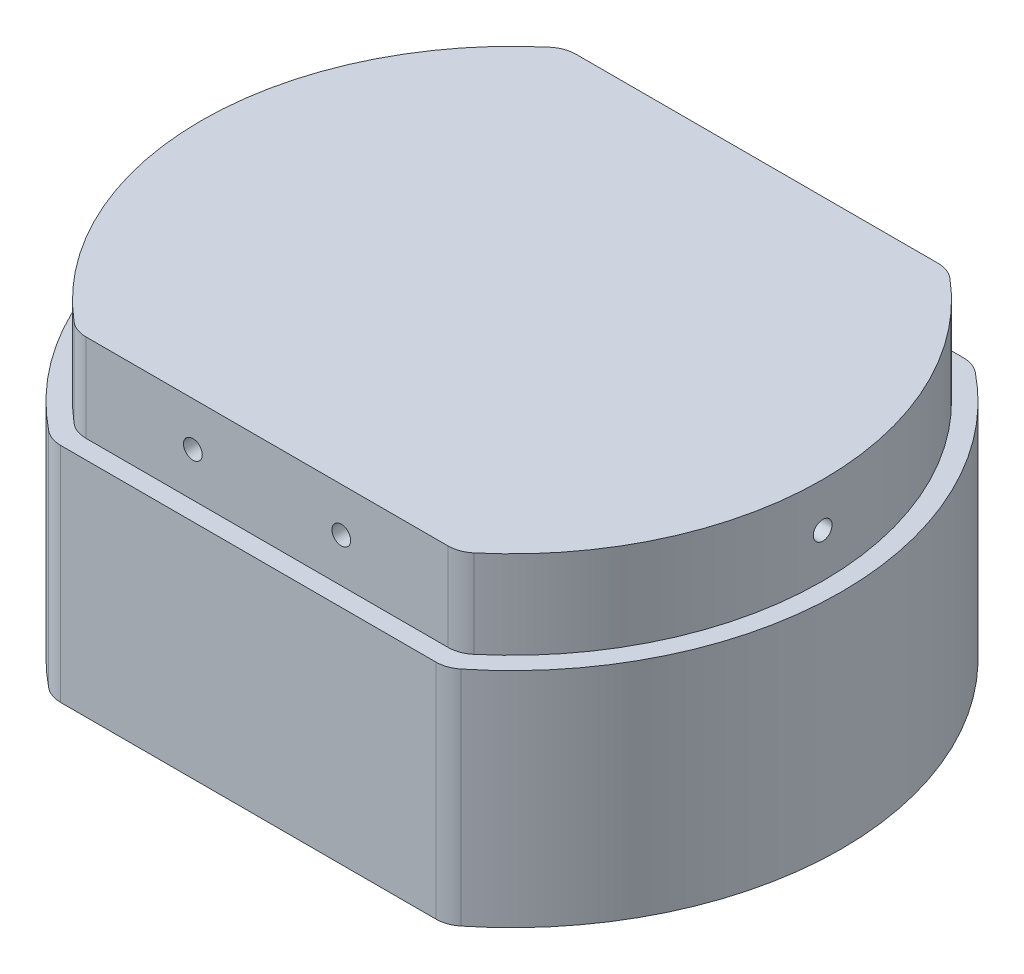
ISO-10303-21;
HEADER;
FILE_DESCRIPTION(('STEP AP214'),'2;1');
FILE_NAME('part.step','',(''),(''),'','','');
FILE_SCHEMA(('AUTOMOTIVE_DESIGN { 1 0 10303 214 1 1 1 1 }'));
ENDSEC;
DATA;
#1=APPLICATION_CONTEXT('core data for automotive mechanical design processes');
#2=APPLICATION_PROTOCOL_DEFINITION('international standard','automotive_design',2000,#1);
#3=PRODUCT_CONTEXT('',#1,'mechanical');
#4=PRODUCT('Part','Part','',(#3));
#5=PRODUCT_RELATED_PRODUCT_CATEGORY('part','',(#4));
#6=PRODUCT_DEFINITION_FORMATION('','',#4);
#7=PRODUCT_DEFINITION_CONTEXT('part definition',#1,'design');
#8=PRODUCT_DEFINITION('design','',#6,#7);
#9=PRODUCT_DEFINITION_SHAPE('','',#8);
#10=(LENGTH_UNIT() NAMED_UNIT(*) SI_UNIT(.MILLI.,.METRE.));
#11=(NAMED_UNIT(*) PLANE_ANGLE_UNIT() SI_UNIT($,.RADIAN.));
#12=(NAMED_UNIT(*) SI_UNIT($,.STERADIAN.) SOLID_ANGLE_UNIT());
#13=UNCERTAINTY_MEASURE_WITH_UNIT(LENGTH_MEASURE(1.E-05),#10,'distance_accuracy_value','');
#14=(GEOMETRIC_REPRESENTATION_CONTEXT(3) GLOBAL_UNCERTAINTY_ASSIGNED_CONTEXT((#13)) GLOBAL_UNIT_ASSIGNED_CONTEXT((#10,
#11,#12)) REPRESENTATION_CONTEXT('',''));
#15=CARTESIAN_POINT('',(0.,0.,0.));
#16=DIRECTION('',(0.,0.,1.));
#17=DIRECTION('',(1.,0.,0.));
#18=AXIS2_PLACEMENT_3D('',#15,#16,#17);
#19=CARTESIAN_POINT('',(32.0400140449408,53.,-40.));
#20=DIRECTION('',(0.,-1.,0.));
#21=DIRECTION('',(0.,0.,-1.));
#22=AXIS2_PLACEMENT_3D('',#19,#20,#21);
#23=CYLINDRICAL_SURFACE('',#22,5.00000000000001);
#24=CARTESIAN_POINT('',(32.0400140449408,38.,-40.));
#25=DIRECTION('',(0.,1.,0.));
#26=DIRECTION('',(0.,0.,1.));
#27=AXIS2_PLACEMENT_3D('',#24,#25,#26);
#28=CIRCLE('',#27,5.00000000000001);
#29=CARTESIAN_POINT('',(35.1658690737155,38.,-43.9024390243902));
#30=VERTEX_POINT('',#29);
#31=CARTESIAN_POINT('',(32.0400140449408,38.,-45.));
#32=VERTEX_POINT('',#31);
#33=EDGE_CURVE('E251',#30,#32,#28,.T.);
#34=ORIENTED_EDGE('',*,*,#33,.F.);
#35=DIRECTION('',(0.,-1.,0.));
#36=VECTOR('',#35,1.);
#37=CARTESIAN_POINT('',(35.1658690737155,53.,-43.9024390243902));
#38=LINE('',#37,#36);
#39=CARTESIAN_POINT('',(35.1658690737155,0.,-43.9024390243902));
#40=VERTEX_POINT('',#39);
#41=EDGE_CURVE('E277',#30,#40,#38,.T.);
#42=ORIENTED_EDGE('',*,*,#41,.T.);
#43=CARTESIAN_POINT('',(32.0400140449408,0.,-40.));
#44=DIRECTION('',(0.,1.,0.));
#45=DIRECTION('',(0.,0.,-1.));
#46=AXIS2_PLACEMENT_3D('',#43,#44,#45);
#47=CIRCLE('',#46,5.00000000000001);
#48=CARTESIAN_POINT('',(32.0400140449408,0.,-45.));
#49=VERTEX_POINT('',#48);
#50=EDGE_CURVE('E253',#40,#49,#47,.T.);
#51=ORIENTED_EDGE('',*,*,#50,.T.);
#52=DIRECTION('',(0.,-1.,0.));
#53=VECTOR('',#52,1.);
#54=CARTESIAN_POINT('',(32.0400140449408,53.,-45.));
#55=LINE('',#54,#53);
#56=EDGE_CURVE('E291',#32,#49,#55,.T.);
#57=ORIENTED_EDGE('',*,*,#56,.F.);
#58=EDGE_LOOP('',(#34,#42,#51,#57));
#59=FACE_BOUND('',#58,.T.);
#60=ADVANCED_FACE('F39',(#59),#23,.T.);
#61=CARTESIAN_POINT('',(-32.0400140449408,53.,-45.));
#62=DIRECTION('',(0.,0.,1.));
#63=DIRECTION('',(1.,0.,0.));
#64=AXIS2_PLACEMENT_3D('',#61,#62,#63);
#65=PLANE('',#64);
#66=DIRECTION('',(-1.,0.,0.));
#67=VECTOR('',#66,1.);
#68=CARTESIAN_POINT('',(33.75,38.,-45.));
#69=LINE('',#68,#67);
#70=CARTESIAN_POINT('',(-32.0400140449408,38.,-45.));
#71=VERTEX_POINT('',#70);
#72=EDGE_CURVE('E239',#32,#71,#69,.T.);
#73=ORIENTED_EDGE('',*,*,#72,.F.);
#74=ORIENTED_EDGE('',*,*,#56,.T.);
#75=DIRECTION('',(-1.,0.,0.));
#76=VECTOR('',#75,1.);
#77=CARTESIAN_POINT('',(-32.0400140449408,0.,-45.));
#78=LINE('',#77,#76);
#79=CARTESIAN_POINT('',(-32.0400140449408,0.,-45.));
#80=VERTEX_POINT('',#79);
#81=EDGE_CURVE('E256',#49,#80,#78,.T.);
#82=ORIENTED_EDGE('',*,*,#81,.T.);
#83=DIRECTION('',(0.,-1.,0.));
#84=VECTOR('',#83,1.);
#85=CARTESIAN_POINT('',(-32.0400140449408,53.,-45.));
#86=LINE('',#85,#84);
#87=EDGE_CURVE('E289',#71,#80,#86,.T.);
#88=ORIENTED_EDGE('',*,*,#87,.F.);
#89=EDGE_LOOP('',(#73,#74,#82,#88));
#90=FACE_BOUND('',#89,.T.);
#91=ADVANCED_FACE('F394',(#90),#65,.F.);
#92=CARTESIAN_POINT('',(-32.0400140449408,53.,-40.));
#93=DIRECTION('',(0.,-1.,0.));
#94=DIRECTION('',(0.,0.,-1.));
#95=AXIS2_PLACEMENT_3D('',#92,#93,#94);
#96=CYLINDRICAL_SURFACE('',#95,5.00000000000001);
#97=CARTESIAN_POINT('',(-32.0400140449408,38.,-40.));
#98=DIRECTION('',(0.,1.,0.));
#99=DIRECTION('',(0.,0.,1.));
#100=AXIS2_PLACEMENT_3D('',#97,#98,#99);
#101=CIRCLE('',#100,5.00000000000001);
#102=CARTESIAN_POINT('',(-35.1658690737155,38.,-43.9024390243902));
#103=VERTEX_POINT('',#102);
#104=EDGE_CURVE('E249',#71,#103,#101,.T.);
#105=ORIENTED_EDGE('',*,*,#104,.F.);
#106=ORIENTED_EDGE('',*,*,#87,.T.);
#107=CARTESIAN_POINT('',(-32.0400140449408,0.,-40.));
#108=DIRECTION('',(0.,1.,0.));
#109=DIRECTION('',(0.,0.,1.));
#110=AXIS2_PLACEMENT_3D('',#107,#108,#109);
#111=CIRCLE('',#110,5.00000000000001);
#112=CARTESIAN_POINT('',(-35.1658690737155,0.,-43.9024390243902));
#113=VERTEX_POINT('',#112);
#114=EDGE_CURVE('E259',#80,#113,#111,.T.);
#115=ORIENTED_EDGE('',*,*,#114,.T.);
#116=DIRECTION('',(0.,-1.,0.));
#117=VECTOR('',#116,1.);
#118=CARTESIAN_POINT('',(-35.1658690737155,53.,-43.9024390243902));
#119=LINE('',#118,#117);
#120=EDGE_CURVE('E287',#103,#113,#119,.T.);
#121=ORIENTED_EDGE('',*,*,#120,.F.);
#122=EDGE_LOOP('',(#105,#106,#115,#121));
#123=FACE_BOUND('',#122,.T.);
#124=ADVANCED_FACE('F401',(#123),#96,.T.);
#125=CARTESIAN_POINT('',(0.,53.,0.));
#126=DIRECTION('',(0.,-1.,0.));
#127=DIRECTION('',(0.,0.,-1.));
#128=AXIS2_PLACEMENT_3D('',#125,#126,#127);
#129=CYLINDRICAL_SURFACE('',#128,56.25);
#130=CARTESIAN_POINT('',(0.,38.,0.));
#131=DIRECTION('',(0.,1.,0.));
#132=DIRECTION('',(0.,0.,1.));
#133=AXIS2_PLACEMENT_3D('',#130,#131,#132);
#134=CIRCLE('',#133,56.25);
#135=CARTESIAN_POINT('',(-35.1658690737155,38.,43.9024390243902));
#136=VERTEX_POINT('',#135);
#137=EDGE_CURVE('E241',#103,#136,#134,.T.);
#138=ORIENTED_EDGE('',*,*,#137,.F.);
#139=ORIENTED_EDGE('',*,*,#120,.T.);
#140=CARTESIAN_POINT('',(0.,0.,0.));
#141=DIRECTION('',(0.,1.,0.));
#142=DIRECTION('',(0.,0.,1.));
#143=AXIS2_PLACEMENT_3D('',#140,#141,#142);
#144=CIRCLE('',#143,56.25);
#145=CARTESIAN_POINT('',(-35.1658690737155,0.,43.9024390243902));
#146=VERTEX_POINT('',#145);
#147=EDGE_CURVE('E262',#113,#146,#144,.T.);
#148=ORIENTED_EDGE('',*,*,#147,.T.);
#149=DIRECTION('',(0.,-1.,0.));
#150=VECTOR('',#149,1.);
#151=CARTESIAN_POINT('',(-35.1658690737155,53.,43.9024390243902));
#152=LINE('',#151,#150);
#153=EDGE_CURVE('E285',#136,#146,#152,.T.);
#154=ORIENTED_EDGE('',*,*,#153,.F.);
#155=EDGE_LOOP('',(#138,#139,#148,#154));
#156=FACE_BOUND('',#155,.T.);
#157=ADVANCED_FACE('F462',(#156),#129,.T.);
#158=CARTESIAN_POINT('',(-32.0400140449408,53.,40.));
#159=DIRECTION('',(0.,-1.,0.));
#160=DIRECTION('',(0.,0.,-1.));
#161=AXIS2_PLACEMENT_3D('',#158,#159,#160);
#162=CYLINDRICAL_SURFACE('',#161,4.99999999999999);
#163=CARTESIAN_POINT('',(-32.0400140449408,38.,40.));
#164=DIRECTION('',(0.,1.,0.));
#165=DIRECTION('',(0.,0.,1.));
#166=AXIS2_PLACEMENT_3D('',#163,#164,#165);
#167=CIRCLE('',#166,4.99999999999999);
#168=CARTESIAN_POINT('',(-32.0400140449408,38.,45.));
#169=VERTEX_POINT('',#168);
#170=EDGE_CURVE('E247',#136,#169,#167,.T.);
#171=ORIENTED_EDGE('',*,*,#170,.F.);
#172=ORIENTED_EDGE('',*,*,#153,.T.);
#173=CARTESIAN_POINT('',(-32.0400140449408,0.,40.));
#174=DIRECTION('',(0.,1.,0.));
#175=DIRECTION('',(0.,0.,-1.));
#176=AXIS2_PLACEMENT_3D('',#173,#174,#175);
#177=CIRCLE('',#176,4.99999999999999);
#178=CARTESIAN_POINT('',(-32.0400140449408,0.,45.));
#179=VERTEX_POINT('',#178);
#180=EDGE_CURVE('E265',#146,#179,#177,.T.);
#181=ORIENTED_EDGE('',*,*,#180,.T.);
#182=DIRECTION('',(0.,-1.,0.));
#183=VECTOR('',#182,1.);
#184=CARTESIAN_POINT('',(-32.0400140449408,53.,45.));
#185=LINE('',#184,#183);
#186=EDGE_CURVE('E283',#169,#179,#185,.T.);
#187=ORIENTED_EDGE('',*,*,#186,.F.);
#188=EDGE_LOOP('',(#171,#172,#181,#187));
#189=FACE_BOUND('',#188,.T.);
#190=ADVANCED_FACE('F464',(#189),#162,.T.);
#191=CARTESIAN_POINT('',(-32.0400140449408,53.,45.));
#192=DIRECTION('',(0.,0.,-1.));
#193=DIRECTION('',(-1.,0.,0.));
#194=AXIS2_PLACEMENT_3D('',#191,#192,#193);
#195=PLANE('',#194);
#196=DIRECTION('',(1.,0.,0.));
#197=VECTOR('',#196,1.);
#198=CARTESIAN_POINT('',(33.75,38.,45.));
#199=LINE('',#198,#197);
#200=CARTESIAN_POINT('',(32.0400140449408,38.,45.));
#201=VERTEX_POINT('',#200);
#202=EDGE_CURVE('E243',#169,#201,#199,.T.);
#203=ORIENTED_EDGE('',*,*,#202,.F.);
#204=ORIENTED_EDGE('',*,*,#186,.T.);
#205=DIRECTION('',(1.,0.,0.));
#206=VECTOR('',#205,1.);
#207=CARTESIAN_POINT('',(-32.0400140449408,0.,45.));
#208=LINE('',#207,#206);
#209=CARTESIAN_POINT('',(32.0400140449408,0.,45.));
#210=VERTEX_POINT('',#209);
#211=EDGE_CURVE('E268',#179,#210,#208,.T.);
#212=ORIENTED_EDGE('',*,*,#211,.T.);
#213=DIRECTION('',(0.,-1.,0.));
#214=VECTOR('',#213,1.);
#215=CARTESIAN_POINT('',(32.0400140449408,53.,45.));
#216=LINE('',#215,#214);
#217=EDGE_CURVE('E281',#201,#210,#216,.T.);
#218=ORIENTED_EDGE('',*,*,#217,.F.);
#219=EDGE_LOOP('',(#203,#204,#212,#218));
#220=FACE_BOUND('',#219,.T.);
#221=ADVANCED_FACE('F471',(#220),#195,.F.);
#222=CARTESIAN_POINT('',(32.0400140449408,53.,40.));
#223=DIRECTION('',(0.,-1.,0.));
#224=DIRECTION('',(0.,0.,-1.));
#225=AXIS2_PLACEMENT_3D('',#222,#223,#224);
#226=CYLINDRICAL_SURFACE('',#225,4.99999999999999);
#227=CARTESIAN_POINT('',(32.0400140449408,38.,40.));
#228=DIRECTION('',(0.,1.,0.));
#229=DIRECTION('',(0.,0.,1.));
#230=AXIS2_PLACEMENT_3D('',#227,#228,#229);
#231=CIRCLE('',#230,4.99999999999999);
#232=CARTESIAN_POINT('',(35.1658690737155,38.,43.9024390243902));
#233=VERTEX_POINT('',#232);
#234=EDGE_CURVE('E245',#201,#233,#231,.T.);
#235=ORIENTED_EDGE('',*,*,#234,.F.);
#236=ORIENTED_EDGE('',*,*,#217,.T.);
#237=CARTESIAN_POINT('',(32.0400140449408,0.,40.));
#238=DIRECTION('',(0.,1.,0.));
#239=DIRECTION('',(0.,0.,1.));
#240=AXIS2_PLACEMENT_3D('',#237,#238,#239);
#241=CIRCLE('',#240,4.99999999999999);
#242=CARTESIAN_POINT('',(35.1658690737155,0.,43.9024390243902));
#243=VERTEX_POINT('',#242);
#244=EDGE_CURVE('E271',#210,#243,#241,.T.);
#245=ORIENTED_EDGE('',*,*,#244,.T.);
#246=DIRECTION('',(0.,-1.,0.));
#247=VECTOR('',#246,1.);
#248=CARTESIAN_POINT('',(35.1658690737155,53.,43.9024390243902));
#249=LINE('',#248,#247);
#250=EDGE_CURVE('E279',#233,#243,#249,.T.);
#251=ORIENTED_EDGE('',*,*,#250,.F.);
#252=EDGE_LOOP('',(#235,#236,#245,#251));
#253=FACE_BOUND('',#252,.T.);
#254=ADVANCED_FACE('F473',(#253),#226,.T.);
#255=CARTESIAN_POINT('',(0.,53.,0.));
#256=DIRECTION('',(0.,-1.,0.));
#257=DIRECTION('',(0.,0.,-1.));
#258=AXIS2_PLACEMENT_3D('',#255,#256,#257);
#259=CYLINDRICAL_SURFACE('',#258,56.25);
#260=CARTESIAN_POINT('',(0.,38.,0.));
#261=DIRECTION('',(0.,1.,0.));
#262=DIRECTION('',(0.,0.,1.));
#263=AXIS2_PLACEMENT_3D('',#260,#261,#262);
#264=CIRCLE('',#263,56.25);
#265=EDGE_CURVE('E227',#233,#30,#264,.T.);
#266=ORIENTED_EDGE('',*,*,#265,.F.);
#267=ORIENTED_EDGE('',*,*,#250,.T.);
#268=CARTESIAN_POINT('',(0.,0.,0.));
#269=DIRECTION('',(0.,1.,0.));
#270=DIRECTION('',(0.,0.,1.));
#271=AXIS2_PLACEMENT_3D('',#268,#269,#270);
#272=CIRCLE('',#271,56.25);
#273=EDGE_CURVE('E274',#243,#40,#272,.T.);
#274=ORIENTED_EDGE('',*,*,#273,.T.);
#275=ORIENTED_EDGE('',*,*,#41,.F.);
#276=EDGE_LOOP('',(#266,#267,#274,#275));
#277=FACE_BOUND('',#276,.T.);
#278=ADVANCED_FACE('F476',(#277),#259,.T.);
#279=CARTESIAN_POINT('',(32.0400140449408,0.,-40.));
#280=DIRECTION('',(0.,-1.,0.));
#281=DIRECTION('',(0.,0.,-1.));
#282=AXIS2_PLACEMENT_3D('',#279,#280,#281);
#283=PLANE('',#282);
#284=ORIENTED_EDGE('',*,*,#50,.F.);
#285=ORIENTED_EDGE('',*,*,#273,.F.);
#286=ORIENTED_EDGE('',*,*,#244,.F.);
#287=ORIENTED_EDGE('',*,*,#211,.F.);
#288=ORIENTED_EDGE('',*,*,#180,.F.);
#289=ORIENTED_EDGE('',*,*,#147,.F.);
#290=ORIENTED_EDGE('',*,*,#114,.F.);
#291=ORIENTED_EDGE('',*,*,#81,.F.);
#292=EDGE_LOOP('',(#284,#285,#286,#287,#288,#289,#290,#291));
#293=FACE_BOUND('',#292,.T.);
#294=ADVANCED_FACE('F440',(#293),#283,.T.);
#295=CARTESIAN_POINT('',(0.,38.,0.));
#296=DIRECTION('',(0.,1.,0.));
#297=DIRECTION('',(0.,0.,1.));
#298=AXIS2_PLACEMENT_3D('',#295,#296,#297);
#299=PLANE('',#298);
#300=DIRECTION('',(-1.,0.,0.));
#301=VECTOR('',#300,1.);
#302=CARTESIAN_POINT('',(32.6659226105739,38.,-41.8));
#303=LINE('',#302,#301);
#304=CARTESIAN_POINT('',(30.895994886069,38.,-41.8));
#305=VERTEX_POINT('',#304);
#306=CARTESIAN_POINT('',(-30.895994886069,38.,-41.8));
#307=VERTEX_POINT('',#306);
#308=EDGE_CURVE('E224',#305,#307,#303,.T.);
#309=ORIENTED_EDGE('',*,*,#308,.F.);
#310=CARTESIAN_POINT('',(30.895994886069,38.,-36.8));
#311=DIRECTION('',(0.,1.,0.));
#312=DIRECTION('',(0.,0.,1.));
#313=AXIS2_PLACEMENT_3D('',#310,#311,#312);
#314=CIRCLE('',#313,5.);
#315=CARTESIAN_POINT('',(34.1109787451813,38.,-40.6293444328824));
#316=VERTEX_POINT('',#315);
#317=EDGE_CURVE('E322',#305,#316,#314,.F.);
#318=ORIENTED_EDGE('',*,*,#317,.T.);
#319=CARTESIAN_POINT('',(0.,38.,0.));
#320=DIRECTION('',(0.,1.,0.));
#321=DIRECTION('',(0.,0.,1.));
#322=AXIS2_PLACEMENT_3D('',#319,#320,#321);
#323=CIRCLE('',#322,53.05);
#324=CARTESIAN_POINT('',(34.1109787451813,38.,40.6293444328824));
#325=VERTEX_POINT('',#324);
#326=EDGE_CURVE('E221',#325,#316,#323,.T.);
#327=ORIENTED_EDGE('',*,*,#326,.F.);
#328=CARTESIAN_POINT('',(30.895994886069,38.,36.8));
#329=DIRECTION('',(0.,1.,0.));
#330=DIRECTION('',(0.,0.,1.));
#331=AXIS2_PLACEMENT_3D('',#328,#329,#330);
#332=CIRCLE('',#331,5.);
#333=CARTESIAN_POINT('',(30.895994886069,38.,41.8));
#334=VERTEX_POINT('',#333);
#335=EDGE_CURVE('E59',#325,#334,#332,.F.);
#336=ORIENTED_EDGE('',*,*,#335,.T.);
#337=DIRECTION('',(1.,0.,0.));
#338=VECTOR('',#337,1.);
#339=CARTESIAN_POINT('',(32.6659226105739,38.,41.8));
#340=LINE('',#339,#338);
#341=CARTESIAN_POINT('',(-30.895994886069,38.,41.8));
#342=VERTEX_POINT('',#341);
#343=EDGE_CURVE('E218',#342,#334,#340,.T.);
#344=ORIENTED_EDGE('',*,*,#343,.F.);
#345=CARTESIAN_POINT('',(-30.895994886069,38.,36.8));
#346=DIRECTION('',(0.,1.,0.));
#347=DIRECTION('',(0.,0.,1.));
#348=AXIS2_PLACEMENT_3D('',#345,#346,#347);
#349=CIRCLE('',#348,5.);
#350=CARTESIAN_POINT('',(-34.1109787451813,38.,40.6293444328824));
#351=VERTEX_POINT('',#350);
#352=EDGE_CURVE('E325',#342,#351,#349,.F.);
#353=ORIENTED_EDGE('',*,*,#352,.T.);
#354=CARTESIAN_POINT('',(0.,38.,0.));
#355=DIRECTION('',(0.,1.,0.));
#356=DIRECTION('',(0.,0.,1.));
#357=AXIS2_PLACEMENT_3D('',#354,#355,#356);
#358=CIRCLE('',#357,53.05);
#359=CARTESIAN_POINT('',(-34.1109787451813,38.,-40.6293444328824));
#360=VERTEX_POINT('',#359);
#361=EDGE_CURVE('E215',#360,#351,#358,.T.);
#362=ORIENTED_EDGE('',*,*,#361,.F.);
#363=CARTESIAN_POINT('',(-30.895994886069,38.,-36.8));
#364=DIRECTION('',(0.,1.,0.));
#365=DIRECTION('',(0.,0.,1.));
#366=AXIS2_PLACEMENT_3D('',#363,#364,#365);
#367=CIRCLE('',#366,5.);
#368=EDGE_CURVE('E320',#360,#307,#367,.F.);
#369=ORIENTED_EDGE('',*,*,#368,.T.);
#370=EDGE_LOOP('',(#309,#318,#327,#336,#344,#353,#362,#369));
#371=FACE_BOUND('',#370,.T.);
#372=ORIENTED_EDGE('',*,*,#33,.T.);
#373=ORIENTED_EDGE('',*,*,#72,.T.);
#374=ORIENTED_EDGE('',*,*,#104,.T.);
#375=ORIENTED_EDGE('',*,*,#137,.T.);
#376=ORIENTED_EDGE('',*,*,#170,.T.);
#377=ORIENTED_EDGE('',*,*,#202,.T.);
#378=ORIENTED_EDGE('',*,*,#234,.T.);
#379=ORIENTED_EDGE('',*,*,#265,.T.);
#380=EDGE_LOOP('',(#372,#373,#374,#375,#376,#377,#378,#379));
#381=FACE_BOUND('',#380,.T.);
#382=ADVANCED_FACE('F389',(#371,#381),#299,.T.);
#383=CARTESIAN_POINT('',(0.,38.,0.));
#384=DIRECTION('',(0.,1.,0.));
#385=DIRECTION('',(0.,0.,1.));
#386=AXIS2_PLACEMENT_3D('',#383,#384,#385);
#387=CYLINDRICAL_SURFACE('',#386,53.05);
#388=CARTESIAN_POINT('',(-53.0258663295566,45.5,1.6));
#389=CARTESIAN_POINT('',(-53.0258666551798,45.5898507709966,1.59999602219364));
#390=CARTESIAN_POINT('',(-53.0260971569791,45.6797661720912,1.59240600658441));
#391=CARTESIAN_POINT('',(-53.0269944805379,45.8571191528165,1.56223409653119));
#392=CARTESIAN_POINT('',(-53.027661823429,45.9445536426876,1.53963429562111));
#393=CARTESIAN_POINT('',(-53.029357164328,46.1143498326904,1.48008811468606));
#394=CARTESIAN_POINT('',(-53.0303849858318,46.1967139922894,1.44314875490988));
#395=CARTESIAN_POINT('',(-53.0326852434386,46.3540491918854,1.35598210062878));
#396=CARTESIAN_POINT('',(-53.0339576198195,46.4290220301454,1.30575804921354));
#397=CARTESIAN_POINT('',(-53.0366042995548,46.5695039015245,1.19342063613849));
#398=CARTESIAN_POINT('',(-53.0379786423478,46.6350092436112,1.13130265929336));
#399=CARTESIAN_POINT('',(-53.0406739976616,46.7546656113844,0.996948756170966));
#400=CARTESIAN_POINT('',(-53.0419950080565,46.8088161848424,0.924712427099172));
#401=CARTESIAN_POINT('',(-53.0444349851347,46.9042316774968,0.772158604202327));
#402=CARTESIAN_POINT('',(-53.0455539170344,46.9454943792079,0.691839722834399));
#403=CARTESIAN_POINT('',(-53.0474632968336,47.0139483961234,0.525410645635268));
#404=CARTESIAN_POINT('',(-53.048253746057,47.0411397680377,0.439300473145548));
#405=CARTESIAN_POINT('',(-53.049416843146,47.0806713172919,0.263761080543658));
#406=CARTESIAN_POINT('',(-53.0497896189451,47.093016042246,0.174332885417474));
#407=CARTESIAN_POINT('',(-53.0500757772162,47.1025178855195,-0.00532721539350098));
#408=CARTESIAN_POINT('',(-53.0499891615316,47.0996750647793,-0.0955591178519422));
#409=CARTESIAN_POINT('',(-53.049366410037,47.078886355682,-0.274234469419338));
#410=CARTESIAN_POINT('',(-53.0488304203788,47.0609453777502,-0.362678490431324));
#411=CARTESIAN_POINT('',(-53.0473694966257,47.0104772287942,-0.535298776546206));
#412=CARTESIAN_POINT('',(-53.0464445616717,46.9779500255462,-0.619475032220328));
#413=CARTESIAN_POINT('',(-53.0443097402803,46.8992271248273,-0.781186113665243));
#414=CARTESIAN_POINT('',(-53.0430998069433,46.8530291773669,-0.85871984346991));
#415=CARTESIAN_POINT('',(-53.0405313445479,46.7482778559259,-1.00493294568949));
#416=CARTESIAN_POINT('',(-53.0391728151455,46.689724453353,-1.07361229761338));
#417=CARTESIAN_POINT('',(-53.0364596228461,46.5618965433296,-1.20019571727241));
#418=CARTESIAN_POINT('',(-53.0351049617047,46.4926177746457,-1.25809548200536));
#419=CARTESIAN_POINT('',(-53.0325527761151,46.3453207387661,-1.36144303096168));
#420=CARTESIAN_POINT('',(-53.0313552516927,46.2673024701277,-1.40689081312923));
#421=CARTESIAN_POINT('',(-53.0292524069276,46.1047386792692,-1.48404382541968));
#422=CARTESIAN_POINT('',(-53.0283470895525,46.0201930907718,-1.51574891597995));
#423=CARTESIAN_POINT('',(-53.0269308637062,45.84697571136,-1.56451377876046));
#424=CARTESIAN_POINT('',(-53.0264199541484,45.7583039318155,-1.58157359133421));
#425=CARTESIAN_POINT('',(-53.0258503482931,45.5793886872404,-1.60055835066319));
#426=CARTESIAN_POINT('',(-53.0257914738818,45.4891458552959,-1.6024892586163));
#427=CARTESIAN_POINT('',(-53.0261321120539,45.3096173076116,-1.59117693173563));
#428=CARTESIAN_POINT('',(-53.0265316241002,45.2203315907503,-1.577933714682));
#429=CARTESIAN_POINT('',(-53.0277438359172,45.0452684175031,-1.53665400319982));
#430=CARTESIAN_POINT('',(-53.0285564600202,44.9594903217512,-1.50862021785056));
#431=CARTESIAN_POINT('',(-53.0305032245003,44.7938577002409,-1.43855789786098));
#432=CARTESIAN_POINT('',(-53.0316373655317,44.7140031865362,-1.39652933474394));
#433=CARTESIAN_POINT('',(-53.0340997472429,44.5624570598273,-1.29965513936567));
#434=CARTESIAN_POINT('',(-53.0354280486714,44.4907680141646,-1.24480549242388));
#435=CARTESIAN_POINT('',(-53.0381287958894,44.3576136066456,-1.12385200715956));
#436=CARTESIAN_POINT('',(-53.0395012417928,44.2961482711222,-1.05774813985076));
#437=CARTESIAN_POINT('',(-53.0421360801818,44.1851661753861,-0.916137136309798));
#438=CARTESIAN_POINT('',(-53.0433984371739,44.1356532596999,-0.840626986331161));
#439=CARTESIAN_POINT('',(-53.0456702916105,44.0500077880897,-0.682362265788191));
#440=CARTESIAN_POINT('',(-53.0466797896277,44.0138752018554,-0.599607711635075));
#441=CARTESIAN_POINT('',(-53.04833195983,43.9560228006001,-0.429217776348124));
#442=CARTESIAN_POINT('',(-53.0489746954063,43.9343004947974,-0.341583241546934));
#443=CARTESIAN_POINT('',(-53.0498211395266,43.905877101577,-0.163908971593691));
#444=CARTESIAN_POINT('',(-53.0500248484675,43.8991760005759,-0.0738692386166777));
#445=CARTESIAN_POINT('',(-53.0499702799977,43.9009855252937,0.106021077338721));
#446=CARTESIAN_POINT('',(-53.0497121865581,43.9094900934337,0.195871721369931));
#447=CARTESIAN_POINT('',(-53.0487634559797,43.9414570855067,0.3728692831096));
#448=CARTESIAN_POINT('',(-53.0480728179851,43.9649195390412,0.460016195467047));
#449=CARTESIAN_POINT('',(-53.0463367899806,44.0261354527254,0.629134821349297));
#450=CARTESIAN_POINT('',(-53.0452913940587,44.0638891510407,0.711106448600675));
#451=CARTESIAN_POINT('',(-53.0429636387326,44.1526137861256,0.867546173483541));
#452=CARTESIAN_POINT('',(-53.0416812878909,44.2035842453317,0.942014542096632));
#453=CARTESIAN_POINT('',(-53.0390235951992,44.3173133993383,1.08136172363653));
#454=CARTESIAN_POINT('',(-53.0376482263247,44.3800755294701,1.14623773210146));
#455=CARTESIAN_POINT('',(-53.0349594636936,44.5156188476876,1.26455007389084));
#456=CARTESIAN_POINT('',(-53.0336460853668,44.5884025127185,1.31798357068918));
#457=CARTESIAN_POINT('',(-53.031228956799,44.7419515045177,1.41190329516562));
#458=CARTESIAN_POINT('',(-53.0301253434401,44.8227219911869,1.45238108029838));
#459=CARTESIAN_POINT('',(-53.028254699306,44.989853365645,1.51915433918736));
#460=CARTESIAN_POINT('',(-53.0274872673921,45.0762074489272,1.54546672403266));
#461=CARTESIAN_POINT('',(-53.0265806561832,45.2192557994696,1.57618968398188));
#462=CARTESIAN_POINT('',(-53.0263139475865,45.2750215797994,1.5851073165116));
#463=CARTESIAN_POINT('',(-53.0259566820629,45.3871830787161,1.59701372255517));
#464=CARTESIAN_POINT('',(-53.0258661250836,45.443578797115,1.60000249783743));
#465=CARTESIAN_POINT('',(-53.0258663295566,45.5,1.6));
#466=B_SPLINE_CURVE_WITH_KNOTS('',3,(#388,#389,#390,#391,#392,#393,#394,#395,#396,#397,#398,
#399,#400,#401,#402,#403,#404,#405,#406,#407,#408,#409,#410,#411,#412,#413,#414,#415,#416,#417,
#418,#419,#420,#421,#422,#423,#424,#425,#426,#427,#428,#429,#430,#431,#432,#433,#434,#435,#436,
#437,#438,#439,#440,#441,#442,#443,#444,#445,#446,#447,#448,#449,#450,#451,#452,#453,#454,#455,
#456,#457,#458,#459,#460,#461,#462,#463,#464,#465),.UNSPECIFIED.,.T.,.F.,(4,2,2,2,2,2,2,2,2,2,2,
2,2,2,2,2,2,2,2,2,2,2,2,2,2,2,2,2,2,2,2,2,2,2,2,2,2,2,4),(0.,0.269346368082348,
0.539014641223175,0.80855105844834,1.0780217364506,1.34759718951035,1.6171833769652,
1.8868159238606,2.15644738408184,2.42599623356669,2.6955440014795,2.96500413731589,
3.2344648684445,3.50396997326047,3.77347570176085,4.04308878213231,4.31270190701714,
4.582317769869,4.85193288982056,5.12144176877284,5.39095033193072,5.66040954832167,
5.92986931301463,6.19941356724907,6.46895851572963,6.73859004885437,7.00822097118118,
7.27780527631176,7.5473893376633,7.81686602702919,8.08634324968803,8.35582496342072,
8.6252969412794,8.89484754794924,9.16446489735275,9.43425758595542,9.703727469483,
9.8728618068308,10.0419960937308),.UNSPECIFIED.);
#467=CARTESIAN_POINT('',(-53.0258663295566,45.5,1.6));
#468=VERTEX_POINT('',#467);
#469=EDGE_CURVE('E11',#468,#468,#466,.T.);
#470=ORIENTED_EDGE('',*,*,#469,.F.);
#471=EDGE_LOOP('',(#470));
#472=FACE_BOUND('',#471,.T.);
#473=CARTESIAN_POINT('',(0.,53.,0.));
#474=DIRECTION('',(0.,1.,0.));
#475=DIRECTION('',(0.,0.,1.));
#476=AXIS2_PLACEMENT_3D('',#473,#474,#475);
#477=CIRCLE('',#476,53.05);
#478=CARTESIAN_POINT('',(-34.1109787451813,53.,-40.6293444328824));
#479=VERTEX_POINT('',#478);
#480=CARTESIAN_POINT('',(-34.1109787451813,53.,40.6293444328824));
#481=VERTEX_POINT('',#480);
#482=EDGE_CURVE('E214',#479,#481,#477,.T.);
#483=ORIENTED_EDGE('',*,*,#482,.F.);
#484=DIRECTION('',(0.,1.,0.));
#485=VECTOR('',#484,1.);
#486=CARTESIAN_POINT('',(-34.1109787451813,38.,-40.6293444328824));
#487=LINE('',#486,#485);
#488=EDGE_CURVE('E309',#479,#360,#487,.F.);
#489=ORIENTED_EDGE('',*,*,#488,.T.);
#490=ORIENTED_EDGE('',*,*,#361,.T.);
#491=DIRECTION('',(0.,1.,0.));
#492=VECTOR('',#491,1.);
#493=CARTESIAN_POINT('',(-34.1109787451812,38.,40.6293444328824));
#494=LINE('',#493,#492);
#495=EDGE_CURVE('E306',#351,#481,#494,.T.);
#496=ORIENTED_EDGE('',*,*,#495,.T.);
#497=EDGE_LOOP('',(#483,#489,#490,#496));
#498=FACE_BOUND('',#497,.T.);
#499=ADVANCED_FACE('F379',(#472,#498),#387,.T.);
#500=CARTESIAN_POINT('',(32.6659226105739,38.,-41.8));
#501=DIRECTION('',(0.,0.,-1.));
#502=DIRECTION('',(-1.,0.,0.));
#503=AXIS2_PLACEMENT_3D('',#500,#501,#502);
#504=PLANE('',#503);
#505=CARTESIAN_POINT('',(12.6659226105739,45.5,-41.8));
#506=DIRECTION('',(0.,0.,-1.));
#507=DIRECTION('',(-1.,0.,0.));
#508=AXIS2_PLACEMENT_3D('',#505,#506,#507);
#509=CIRCLE('',#508,1.6);
#510=CARTESIAN_POINT('',(11.0659226105739,45.5,-41.8));
#511=VERTEX_POINT('',#510);
#512=EDGE_CURVE('E202',#511,#511,#509,.T.);
#513=ORIENTED_EDGE('',*,*,#512,.F.);
#514=EDGE_LOOP('',(#513));
#515=FACE_BOUND('',#514,.T.);
#516=CARTESIAN_POINT('',(-12.6659226105739,45.5,-41.8));
#517=DIRECTION('',(0.,0.,-1.));
#518=DIRECTION('',(-1.,0.,0.));
#519=AXIS2_PLACEMENT_3D('',#516,#517,#518);
#520=CIRCLE('',#519,1.6);
#521=CARTESIAN_POINT('',(-14.2659226105739,45.5,-41.8));
#522=VERTEX_POINT('',#521);
#523=EDGE_CURVE('E208',#522,#522,#520,.T.);
#524=ORIENTED_EDGE('',*,*,#523,.F.);
#525=EDGE_LOOP('',(#524));
#526=FACE_BOUND('',#525,.T.);
#527=ORIENTED_EDGE('',*,*,#308,.T.);
#528=DIRECTION('',(0.,1.,0.));
#529=VECTOR('',#528,1.);
#530=CARTESIAN_POINT('',(-30.895994886069,38.,-41.8));
#531=LINE('',#530,#529);
#532=CARTESIAN_POINT('',(-30.895994886069,53.,-41.8));
#533=VERTEX_POINT('',#532);
#534=EDGE_CURVE('E295',#307,#533,#531,.T.);
#535=ORIENTED_EDGE('',*,*,#534,.T.);
#536=DIRECTION('',(-1.,0.,0.));
#537=VECTOR('',#536,1.);
#538=CARTESIAN_POINT('',(32.6659226105739,53.,-41.8));
#539=LINE('',#538,#537);
#540=CARTESIAN_POINT('',(30.895994886069,53.,-41.8));
#541=VERTEX_POINT('',#540);
#542=EDGE_CURVE('E219',#541,#533,#539,.T.);
#543=ORIENTED_EDGE('',*,*,#542,.F.);
#544=DIRECTION('',(0.,1.,0.));
#545=VECTOR('',#544,1.);
#546=CARTESIAN_POINT('',(30.895994886069,38.,-41.8));
#547=LINE('',#546,#545);
#548=EDGE_CURVE('E293',#541,#305,#547,.F.);
#549=ORIENTED_EDGE('',*,*,#548,.T.);
#550=EDGE_LOOP('',(#527,#535,#543,#549));
#551=FACE_BOUND('',#550,.T.);
#552=ADVANCED_FACE('F377',(#515,#526,#551),#504,.T.);
#553=CARTESIAN_POINT('',(0.,38.,0.));
#554=DIRECTION('',(0.,1.,0.));
#555=DIRECTION('',(0.,0.,1.));
#556=AXIS2_PLACEMENT_3D('',#553,#554,#555);
#557=CYLINDRICAL_SURFACE('',#556,53.05);
#558=CARTESIAN_POINT('',(53.0258663295566,45.5,-1.6));
#559=CARTESIAN_POINT('',(53.0258666551798,45.5898507709966,-1.59999602219364));
#560=CARTESIAN_POINT('',(53.0260971569791,45.6797661720912,-1.59240600658441));
#561=CARTESIAN_POINT('',(53.0269944805379,45.8571191528165,-1.56223409653119));
#562=CARTESIAN_POINT('',(53.027661823429,45.9445536426876,-1.53963429562111));
#563=CARTESIAN_POINT('',(53.029357164328,46.1143498326904,-1.48008811468606));
#564=CARTESIAN_POINT('',(53.0303849858318,46.1967139922894,-1.44314875490988));
#565=CARTESIAN_POINT('',(53.0326852434386,46.3540491918854,-1.35598210062878));
#566=CARTESIAN_POINT('',(53.0339576198195,46.4290220301454,-1.30575804921354));
#567=CARTESIAN_POINT('',(53.0366042995548,46.5695039015245,-1.19342063613849));
#568=CARTESIAN_POINT('',(53.0379786423478,46.6350092436112,-1.13130265929336));
#569=CARTESIAN_POINT('',(53.0406739976616,46.7546656113844,-0.996948756170966));
#570=CARTESIAN_POINT('',(53.0419950080565,46.8088161848424,-0.924712427099172));
#571=CARTESIAN_POINT('',(53.0444349851347,46.9042316774968,-0.772158604202327));
#572=CARTESIAN_POINT('',(53.0455539170344,46.9454943792079,-0.691839722834399));
#573=CARTESIAN_POINT('',(53.0474632968336,47.0139483961234,-0.525410645635268));
#574=CARTESIAN_POINT('',(53.048253746057,47.0411397680377,-0.439300473145548));
#575=CARTESIAN_POINT('',(53.049416843146,47.0806713172919,-0.263761080543658));
#576=CARTESIAN_POINT('',(53.0497896189451,47.093016042246,-0.174332885417474));
#577=CARTESIAN_POINT('',(53.0500757772162,47.1025178855195,0.00532721539350098));
#578=CARTESIAN_POINT('',(53.0499891615316,47.0996750647793,0.0955591178519422));
#579=CARTESIAN_POINT('',(53.049366410037,47.078886355682,0.274234469419338));
#580=CARTESIAN_POINT('',(53.0488304203788,47.0609453777502,0.362678490431324));
#581=CARTESIAN_POINT('',(53.0473694966257,47.0104772287942,0.535298776546206));
#582=CARTESIAN_POINT('',(53.0464445616717,46.9779500255462,0.619475032220328));
#583=CARTESIAN_POINT('',(53.0443097402803,46.8992271248273,0.781186113665243));
#584=CARTESIAN_POINT('',(53.0430998069433,46.8530291773669,0.85871984346991));
#585=CARTESIAN_POINT('',(53.0405313445479,46.7482778559259,1.00493294568949));
#586=CARTESIAN_POINT('',(53.0391728151455,46.689724453353,1.07361229761338));
#587=CARTESIAN_POINT('',(53.0364596228461,46.5618965433296,1.20019571727241));
#588=CARTESIAN_POINT('',(53.0351049617047,46.4926177746457,1.25809548200536));
#589=CARTESIAN_POINT('',(53.0325527761151,46.3453207387661,1.36144303096168));
#590=CARTESIAN_POINT('',(53.0313552516927,46.2673024701277,1.40689081312923));
#591=CARTESIAN_POINT('',(53.0292524069276,46.1047386792692,1.48404382541968));
#592=CARTESIAN_POINT('',(53.0283470895525,46.0201930907718,1.51574891597995));
#593=CARTESIAN_POINT('',(53.0269308637062,45.84697571136,1.56451377876046));
#594=CARTESIAN_POINT('',(53.0264199541484,45.7583039318155,1.58157359133421));
#595=CARTESIAN_POINT('',(53.0258503482931,45.5793886872404,1.60055835066319));
#596=CARTESIAN_POINT('',(53.0257914738818,45.4891458552959,1.6024892586163));
#597=CARTESIAN_POINT('',(53.0261321120539,45.3096173076116,1.59117693173563));
#598=CARTESIAN_POINT('',(53.0265316241002,45.2203315907503,1.577933714682));
#599=CARTESIAN_POINT('',(53.0277438359172,45.0452684175031,1.53665400319982));
#600=CARTESIAN_POINT('',(53.0285564600202,44.9594903217512,1.50862021785056));
#601=CARTESIAN_POINT('',(53.0305032245003,44.7938577002409,1.43855789786098));
#602=CARTESIAN_POINT('',(53.0316373655317,44.7140031865362,1.39652933474394));
#603=CARTESIAN_POINT('',(53.0340997472429,44.5624570598273,1.29965513936567));
#604=CARTESIAN_POINT('',(53.0354280486714,44.4907680141646,1.24480549242388));
#605=CARTESIAN_POINT('',(53.0381287958894,44.3576136066456,1.12385200715956));
#606=CARTESIAN_POINT('',(53.0395012417928,44.2961482711222,1.05774813985076));
#607=CARTESIAN_POINT('',(53.0421360801818,44.1851661753861,0.916137136309798));
#608=CARTESIAN_POINT('',(53.0433984371739,44.1356532596999,0.840626986331161));
#609=CARTESIAN_POINT('',(53.0456702916105,44.0500077880897,0.682362265788191));
#610=CARTESIAN_POINT('',(53.0466797896277,44.0138752018554,0.599607711635075));
#611=CARTESIAN_POINT('',(53.04833195983,43.9560228006001,0.429217776348124));
#612=CARTESIAN_POINT('',(53.0489746954063,43.9343004947974,0.341583241546934));
#613=CARTESIAN_POINT('',(53.0498211395266,43.905877101577,0.163908971593691));
#614=CARTESIAN_POINT('',(53.0500248484675,43.8991760005759,0.0738692386166777));
#615=CARTESIAN_POINT('',(53.0499702799977,43.9009855252937,-0.106021077338721));
#616=CARTESIAN_POINT('',(53.0497121865581,43.9094900934337,-0.195871721369931));
#617=CARTESIAN_POINT('',(53.0487634559797,43.9414570855067,-0.3728692831096));
#618=CARTESIAN_POINT('',(53.0480728179851,43.9649195390412,-0.460016195467047));
#619=CARTESIAN_POINT('',(53.0463367899806,44.0261354527254,-0.629134821349297));
#620=CARTESIAN_POINT('',(53.0452913940587,44.0638891510407,-0.711106448600675));
#621=CARTESIAN_POINT('',(53.0429636387326,44.1526137861256,-0.867546173483541));
#622=CARTESIAN_POINT('',(53.0416812878909,44.2035842453317,-0.942014542096632));
#623=CARTESIAN_POINT('',(53.0390235951992,44.3173133993383,-1.08136172363653));
#624=CARTESIAN_POINT('',(53.0376482263247,44.3800755294701,-1.14623773210146));
#625=CARTESIAN_POINT('',(53.0349594636936,44.5156188476876,-1.26455007389084));
#626=CARTESIAN_POINT('',(53.0336460853668,44.5884025127185,-1.31798357068918));
#627=CARTESIAN_POINT('',(53.031228956799,44.7419515045177,-1.41190329516562));
#628=CARTESIAN_POINT('',(53.0301253434401,44.8227219911869,-1.45238108029838));
#629=CARTESIAN_POINT('',(53.028254699306,44.989853365645,-1.51915433918736));
#630=CARTESIAN_POINT('',(53.0274872673921,45.0762074489272,-1.54546672403266));
#631=CARTESIAN_POINT('',(53.0265806561832,45.2192557994696,-1.57618968398188));
#632=CARTESIAN_POINT('',(53.0263139475865,45.2750215797994,-1.5851073165116));
#633=CARTESIAN_POINT('',(53.0259566820629,45.3871830787161,-1.59701372255517));
#634=CARTESIAN_POINT('',(53.0258661250836,45.443578797115,-1.60000249783743));
#635=CARTESIAN_POINT('',(53.0258663295566,45.5,-1.6));
#636=B_SPLINE_CURVE_WITH_KNOTS('',3,(#558,#559,#560,#561,#562,#563,#564,#565,#566,#567,#568,
#569,#570,#571,#572,#573,#574,#575,#576,#577,#578,#579,#580,#581,#582,#583,#584,#585,#586,#587,
#588,#589,#590,#591,#592,#593,#594,#595,#596,#597,#598,#599,#600,#601,#602,#603,#604,#605,#606,
#607,#608,#609,#610,#611,#612,#613,#614,#615,#616,#617,#618,#619,#620,#621,#622,#623,#624,#625,
#626,#627,#628,#629,#630,#631,#632,#633,#634,#635),.UNSPECIFIED.,.T.,.F.,(4,2,2,2,2,2,2,2,2,2,2,
2,2,2,2,2,2,2,2,2,2,2,2,2,2,2,2,2,2,2,2,2,2,2,2,2,2,2,4),(0.,0.269346368082348,
0.539014641223175,0.80855105844834,1.0780217364506,1.34759718951035,1.6171833769652,
1.8868159238606,2.15644738408184,2.42599623356669,2.6955440014795,2.96500413731589,
3.2344648684445,3.50396997326047,3.77347570176085,4.04308878213231,4.31270190701714,
4.582317769869,4.85193288982056,5.12144176877284,5.39095033193072,5.66040954832167,
5.92986931301463,6.19941356724907,6.46895851572963,6.73859004885437,7.00822097118118,
7.27780527631176,7.5473893376633,7.81686602702919,8.08634324968803,8.35582496342072,
8.6252969412794,8.89484754794924,9.16446489735275,9.43425758595542,9.703727469483,
9.8728618068308,10.0419960937308),.UNSPECIFIED.);
#637=CARTESIAN_POINT('',(53.0258663295566,45.5,-1.6));
#638=VERTEX_POINT('',#637);
#639=EDGE_CURVE('E52',#638,#638,#636,.T.);
#640=ORIENTED_EDGE('',*,*,#639,.F.);
#641=EDGE_LOOP('',(#640));
#642=FACE_BOUND('',#641,.T.);
#643=ORIENTED_EDGE('',*,*,#326,.T.);
#644=DIRECTION('',(0.,1.,0.));
#645=VECTOR('',#644,1.);
#646=CARTESIAN_POINT('',(34.1109787451813,38.,-40.6293444328824));
#647=LINE('',#646,#645);
#648=CARTESIAN_POINT('',(34.1109787451813,53.,-40.6293444328824));
#649=VERTEX_POINT('',#648);
#650=EDGE_CURVE('E313',#316,#649,#647,.T.);
#651=ORIENTED_EDGE('',*,*,#650,.T.);
#652=CARTESIAN_POINT('',(0.,53.,0.));
#653=DIRECTION('',(0.,1.,0.));
#654=DIRECTION('',(0.,0.,1.));
#655=AXIS2_PLACEMENT_3D('',#652,#653,#654);
#656=CIRCLE('',#655,53.05);
#657=CARTESIAN_POINT('',(34.1109787451813,53.,40.6293444328824));
#658=VERTEX_POINT('',#657);
#659=EDGE_CURVE('E233',#658,#649,#656,.T.);
#660=ORIENTED_EDGE('',*,*,#659,.F.);
#661=DIRECTION('',(0.,1.,0.));
#662=VECTOR('',#661,1.);
#663=CARTESIAN_POINT('',(34.1109787451813,38.,40.6293444328824));
#664=LINE('',#663,#662);
#665=EDGE_CURVE('E311',#658,#325,#664,.F.);
#666=ORIENTED_EDGE('',*,*,#665,.T.);
#667=EDGE_LOOP('',(#643,#651,#660,#666));
#668=FACE_BOUND('',#667,.T.);
#669=ADVANCED_FACE('F332',(#642,#668),#557,.T.);
#670=CARTESIAN_POINT('',(32.6659226105739,38.,41.8));
#671=DIRECTION('',(0.,0.,1.));
#672=DIRECTION('',(1.,0.,0.));
#673=AXIS2_PLACEMENT_3D('',#670,#671,#672);
#674=PLANE('',#673);
#675=CARTESIAN_POINT('',(-12.6659226105739,45.5,41.8));
#676=DIRECTION('',(0.,0.,1.));
#677=DIRECTION('',(1.,0.,0.));
#678=AXIS2_PLACEMENT_3D('',#675,#676,#677);
#679=CIRCLE('',#678,1.6);
#680=CARTESIAN_POINT('',(-11.0659226105739,45.5,41.8));
#681=VERTEX_POINT('',#680);
#682=EDGE_CURVE('E188',#681,#681,#679,.T.);
#683=ORIENTED_EDGE('',*,*,#682,.F.);
#684=EDGE_LOOP('',(#683));
#685=FACE_BOUND('',#684,.T.);
#686=CARTESIAN_POINT('',(12.6659226105739,45.5,41.8));
#687=DIRECTION('',(0.,0.,1.));
#688=DIRECTION('',(1.,0.,0.));
#689=AXIS2_PLACEMENT_3D('',#686,#687,#688);
#690=CIRCLE('',#689,1.6);
#691=CARTESIAN_POINT('',(14.2659226105739,45.5,41.8));
#692=VERTEX_POINT('',#691);
#693=EDGE_CURVE('E196',#692,#692,#690,.T.);
#694=ORIENTED_EDGE('',*,*,#693,.F.);
#695=EDGE_LOOP('',(#694));
#696=FACE_BOUND('',#695,.T.);
#697=ORIENTED_EDGE('',*,*,#343,.T.);
#698=DIRECTION('',(0.,1.,0.));
#699=VECTOR('',#698,1.);
#700=CARTESIAN_POINT('',(30.895994886069,38.,41.8));
#701=LINE('',#700,#699);
#702=CARTESIAN_POINT('',(30.895994886069,53.,41.8));
#703=VERTEX_POINT('',#702);
#704=EDGE_CURVE('E317',#334,#703,#701,.T.);
#705=ORIENTED_EDGE('',*,*,#704,.T.);
#706=DIRECTION('',(1.,0.,0.));
#707=VECTOR('',#706,1.);
#708=CARTESIAN_POINT('',(32.6659226105739,53.,41.8));
#709=LINE('',#708,#707);
#710=CARTESIAN_POINT('',(-30.895994886069,53.,41.8));
#711=VERTEX_POINT('',#710);
#712=EDGE_CURVE('E230',#711,#703,#709,.T.);
#713=ORIENTED_EDGE('',*,*,#712,.F.);
#714=DIRECTION('',(0.,1.,0.));
#715=VECTOR('',#714,1.);
#716=CARTESIAN_POINT('',(-30.895994886069,38.,41.8));
#717=LINE('',#716,#715);
#718=EDGE_CURVE('E66',#711,#342,#717,.F.);
#719=ORIENTED_EDGE('',*,*,#718,.T.);
#720=EDGE_LOOP('',(#697,#705,#713,#719));
#721=FACE_BOUND('',#720,.T.);
#722=ADVANCED_FACE('F386',(#685,#696,#721),#674,.T.);
#723=CARTESIAN_POINT('',(32.0400140449408,53.,-40.));
#724=DIRECTION('',(0.,-1.,0.));
#725=DIRECTION('',(0.,0.,-1.));
#726=AXIS2_PLACEMENT_3D('',#723,#724,#725);
#727=PLANE('',#726);
#728=ORIENTED_EDGE('',*,*,#542,.T.);
#729=CARTESIAN_POINT('',(-30.895994886069,53.,-36.8));
#730=DIRECTION('',(0.,-1.,0.));
#731=DIRECTION('',(0.,0.,-1.));
#732=AXIS2_PLACEMENT_3D('',#729,#730,#731);
#733=CIRCLE('',#732,5.);
#734=EDGE_CURVE('E304',#533,#479,#733,.F.);
#735=ORIENTED_EDGE('',*,*,#734,.T.);
#736=ORIENTED_EDGE('',*,*,#482,.T.);
#737=CARTESIAN_POINT('',(-30.895994886069,53.,36.8));
#738=DIRECTION('',(0.,-1.,0.));
#739=DIRECTION('',(0.,0.,-1.));
#740=AXIS2_PLACEMENT_3D('',#737,#738,#739);
#741=CIRCLE('',#740,5.);
#742=EDGE_CURVE('E298',#481,#711,#741,.F.);
#743=ORIENTED_EDGE('',*,*,#742,.T.);
#744=ORIENTED_EDGE('',*,*,#712,.T.);
#745=CARTESIAN_POINT('',(30.895994886069,53.,36.8));
#746=DIRECTION('',(0.,-1.,0.));
#747=DIRECTION('',(0.,0.,-1.));
#748=AXIS2_PLACEMENT_3D('',#745,#746,#747);
#749=CIRCLE('',#748,5.);
#750=EDGE_CURVE('E300',#703,#658,#749,.F.);
#751=ORIENTED_EDGE('',*,*,#750,.T.);
#752=ORIENTED_EDGE('',*,*,#659,.T.);
#753=CARTESIAN_POINT('',(30.895994886069,53.,-36.8));
#754=DIRECTION('',(0.,-1.,0.));
#755=DIRECTION('',(0.,0.,-1.));
#756=AXIS2_PLACEMENT_3D('',#753,#754,#755);
#757=CIRCLE('',#756,5.);
#758=EDGE_CURVE('E302',#649,#541,#757,.F.);
#759=ORIENTED_EDGE('',*,*,#758,.T.);
#760=EDGE_LOOP('',(#728,#735,#736,#743,#744,#751,#752,#759));
#761=FACE_BOUND('',#760,.T.);
#762=ADVANCED_FACE('F375',(#761),#727,.F.);
#763=CARTESIAN_POINT('',(-12.6659226105739,45.5,-34.9));
#764=DIRECTION('',(0.,0.,-1.));
#765=DIRECTION('',(-1.,0.,0.));
#766=AXIS2_PLACEMENT_3D('',#763,#764,#765);
#767=CONICAL_SURFACE('',#766,1.6,1.02974425867665);
#768=CARTESIAN_POINT('',(-12.6659226105739,45.5,-33.9386230095559));
#769=VERTEX_POINT('',#768);
#770=VERTEX_LOOP('',#769);
#771=FACE_BOUND('',#770,.T.);
#772=CARTESIAN_POINT('',(-12.6659226105739,45.5,-34.9));
#773=DIRECTION('',(0.,0.,-1.));
#774=DIRECTION('',(-1.,0.,0.));
#775=AXIS2_PLACEMENT_3D('',#772,#773,#774);
#776=CIRCLE('',#775,1.6);
#777=CARTESIAN_POINT('',(-14.2659226105739,45.5,-34.9));
#778=VERTEX_POINT('',#777);
#779=EDGE_CURVE('E211',#778,#778,#776,.T.);
#780=ORIENTED_EDGE('',*,*,#779,.T.);
#781=EDGE_LOOP('',(#780));
#782=FACE_BOUND('',#781,.T.);
#783=ADVANCED_FACE('F372',(#771,#782),#767,.F.);
#784=CARTESIAN_POINT('',(-12.6659226105739,45.5,-41.8));
#785=DIRECTION('',(0.,0.,-1.));
#786=DIRECTION('',(-1.,0.,0.));
#787=AXIS2_PLACEMENT_3D('',#784,#785,#786);
#788=CYLINDRICAL_SURFACE('',#787,1.6);
#789=ORIENTED_EDGE('',*,*,#779,.F.);
#790=EDGE_LOOP('',(#789));
#791=FACE_BOUND('',#790,.T.);
#792=ORIENTED_EDGE('',*,*,#523,.T.);
#793=EDGE_LOOP('',(#792));
#794=FACE_BOUND('',#793,.T.);
#795=ADVANCED_FACE('F368',(#791,#794),#788,.F.);
#796=CARTESIAN_POINT('',(12.6659226105739,45.5,-34.9));
#797=DIRECTION('',(0.,0.,-1.));
#798=DIRECTION('',(-1.,0.,0.));
#799=AXIS2_PLACEMENT_3D('',#796,#797,#798);
#800=CONICAL_SURFACE('',#799,1.6,1.02974425867665);
#801=CARTESIAN_POINT('',(12.6659226105739,45.5,-33.9386230095559));
#802=VERTEX_POINT('',#801);
#803=VERTEX_LOOP('',#802);
#804=FACE_BOUND('',#803,.T.);
#805=CARTESIAN_POINT('',(12.6659226105739,45.5,-34.9));
#806=DIRECTION('',(0.,0.,-1.));
#807=DIRECTION('',(-1.,0.,0.));
#808=AXIS2_PLACEMENT_3D('',#805,#806,#807);
#809=CIRCLE('',#808,1.6);
#810=CARTESIAN_POINT('',(11.0659226105739,45.5,-34.9));
#811=VERTEX_POINT('',#810);
#812=EDGE_CURVE('E205',#811,#811,#809,.T.);
#813=ORIENTED_EDGE('',*,*,#812,.T.);
#814=EDGE_LOOP('',(#813));
#815=FACE_BOUND('',#814,.T.);
#816=ADVANCED_FACE('F364',(#804,#815),#800,.F.);
#817=CARTESIAN_POINT('',(12.6659226105739,45.5,-41.8));
#818=DIRECTION('',(0.,0.,-1.));
#819=DIRECTION('',(-1.,0.,0.));
#820=AXIS2_PLACEMENT_3D('',#817,#818,#819);
#821=CYLINDRICAL_SURFACE('',#820,1.6);
#822=ORIENTED_EDGE('',*,*,#812,.F.);
#823=EDGE_LOOP('',(#822));
#824=FACE_BOUND('',#823,.T.);
#825=ORIENTED_EDGE('',*,*,#512,.T.);
#826=EDGE_LOOP('',(#825));
#827=FACE_BOUND('',#826,.T.);
#828=ADVANCED_FACE('F360',(#824,#827),#821,.F.);
#829=CARTESIAN_POINT('',(12.6659226105739,45.5,34.9));
#830=DIRECTION('',(0.,0.,1.));
#831=DIRECTION('',(1.,0.,0.));
#832=AXIS2_PLACEMENT_3D('',#829,#830,#831);
#833=CONICAL_SURFACE('',#832,1.6,1.02974425867665);
#834=CARTESIAN_POINT('',(12.6659226105739,45.5,33.9386230095559));
#835=VERTEX_POINT('',#834);
#836=VERTEX_LOOP('',#835);
#837=FACE_BOUND('',#836,.T.);
#838=CARTESIAN_POINT('',(12.6659226105739,45.5,34.9));
#839=DIRECTION('',(0.,0.,1.));
#840=DIRECTION('',(1.,0.,0.));
#841=AXIS2_PLACEMENT_3D('',#838,#839,#840);
#842=CIRCLE('',#841,1.6);
#843=CARTESIAN_POINT('',(14.2659226105739,45.5,34.9));
#844=VERTEX_POINT('',#843);
#845=EDGE_CURVE('E199',#844,#844,#842,.T.);
#846=ORIENTED_EDGE('',*,*,#845,.T.);
#847=EDGE_LOOP('',(#846));
#848=FACE_BOUND('',#847,.T.);
#849=ADVANCED_FACE('F356',(#837,#848),#833,.F.);
#850=CARTESIAN_POINT('',(12.6659226105739,45.5,41.8));
#851=DIRECTION('',(0.,0.,1.));
#852=DIRECTION('',(1.,0.,0.));
#853=AXIS2_PLACEMENT_3D('',#850,#851,#852);
#854=CYLINDRICAL_SURFACE('',#853,1.6);
#855=ORIENTED_EDGE('',*,*,#845,.F.);
#856=EDGE_LOOP('',(#855));
#857=FACE_BOUND('',#856,.T.);
#858=ORIENTED_EDGE('',*,*,#693,.T.);
#859=EDGE_LOOP('',(#858));
#860=FACE_BOUND('',#859,.T.);
#861=ADVANCED_FACE('F352',(#857,#860),#854,.F.);
#862=CARTESIAN_POINT('',(-12.6659226105739,45.5,34.9));
#863=DIRECTION('',(0.,0.,1.));
#864=DIRECTION('',(1.,0.,0.));
#865=AXIS2_PLACEMENT_3D('',#862,#863,#864);
#866=CONICAL_SURFACE('',#865,1.6,1.02974425867665);
#867=CARTESIAN_POINT('',(-12.6659226105739,45.5,33.9386230095559));
#868=VERTEX_POINT('',#867);
#869=VERTEX_LOOP('',#868);
#870=FACE_BOUND('',#869,.T.);
#871=CARTESIAN_POINT('',(-12.6659226105739,45.5,34.9));
#872=DIRECTION('',(0.,0.,1.));
#873=DIRECTION('',(1.,0.,0.));
#874=AXIS2_PLACEMENT_3D('',#871,#872,#873);
#875=CIRCLE('',#874,1.6);
#876=CARTESIAN_POINT('',(-11.0659226105739,45.5,34.9));
#877=VERTEX_POINT('',#876);
#878=EDGE_CURVE('E193',#877,#877,#875,.T.);
#879=ORIENTED_EDGE('',*,*,#878,.T.);
#880=EDGE_LOOP('',(#879));
#881=FACE_BOUND('',#880,.T.);
#882=ADVANCED_FACE('F348',(#870,#881),#866,.F.);
#883=CARTESIAN_POINT('',(-12.6659226105739,45.5,41.8));
#884=DIRECTION('',(0.,0.,1.));
#885=DIRECTION('',(1.,0.,0.));
#886=AXIS2_PLACEMENT_3D('',#883,#884,#885);
#887=CYLINDRICAL_SURFACE('',#886,1.6);
#888=ORIENTED_EDGE('',*,*,#878,.F.);
#889=EDGE_LOOP('',(#888));
#890=FACE_BOUND('',#889,.T.);
#891=ORIENTED_EDGE('',*,*,#682,.T.);
#892=EDGE_LOOP('',(#891));
#893=FACE_BOUND('',#892,.T.);
#894=ADVANCED_FACE('F344',(#890,#893),#887,.F.);
#895=CARTESIAN_POINT('',(-30.895994886069,38.,-36.8));
#896=DIRECTION('',(0.,1.,0.));
#897=DIRECTION('',(0.,0.,1.));
#898=AXIS2_PLACEMENT_3D('',#895,#896,#897);
#899=CYLINDRICAL_SURFACE('',#898,5.);
#900=ORIENTED_EDGE('',*,*,#368,.F.);
#901=ORIENTED_EDGE('',*,*,#488,.F.);
#902=ORIENTED_EDGE('',*,*,#734,.F.);
#903=ORIENTED_EDGE('',*,*,#534,.F.);
#904=EDGE_LOOP('',(#900,#901,#902,#903));
#905=FACE_BOUND('',#904,.T.);
#906=ADVANCED_FACE('F347',(#905),#899,.T.);
#907=CARTESIAN_POINT('',(30.895994886069,38.,-36.8));
#908=DIRECTION('',(0.,1.,0.));
#909=DIRECTION('',(0.,0.,1.));
#910=AXIS2_PLACEMENT_3D('',#907,#908,#909);
#911=CYLINDRICAL_SURFACE('',#910,5.);
#912=ORIENTED_EDGE('',*,*,#317,.F.);
#913=ORIENTED_EDGE('',*,*,#548,.F.);
#914=ORIENTED_EDGE('',*,*,#758,.F.);
#915=ORIENTED_EDGE('',*,*,#650,.F.);
#916=EDGE_LOOP('',(#912,#913,#914,#915));
#917=FACE_BOUND('',#916,.T.);
#918=ADVANCED_FACE('F409',(#917),#911,.T.);
#919=CARTESIAN_POINT('',(30.895994886069,38.,36.8));
#920=DIRECTION('',(0.,1.,0.));
#921=DIRECTION('',(0.,0.,1.));
#922=AXIS2_PLACEMENT_3D('',#919,#920,#921);
#923=CYLINDRICAL_SURFACE('',#922,5.);
#924=ORIENTED_EDGE('',*,*,#335,.F.);
#925=ORIENTED_EDGE('',*,*,#665,.F.);
#926=ORIENTED_EDGE('',*,*,#750,.F.);
#927=ORIENTED_EDGE('',*,*,#704,.F.);
#928=EDGE_LOOP('',(#924,#925,#926,#927));
#929=FACE_BOUND('',#928,.T.);
#930=ADVANCED_FACE('F412',(#929),#923,.T.);
#931=CARTESIAN_POINT('',(-30.895994886069,38.,36.8));
#932=DIRECTION('',(0.,1.,0.));
#933=DIRECTION('',(0.,0.,1.));
#934=AXIS2_PLACEMENT_3D('',#931,#932,#933);
#935=CYLINDRICAL_SURFACE('',#934,5.);
#936=ORIENTED_EDGE('',*,*,#352,.F.);
#937=ORIENTED_EDGE('',*,*,#718,.F.);
#938=ORIENTED_EDGE('',*,*,#742,.F.);
#939=ORIENTED_EDGE('',*,*,#495,.F.);
#940=EDGE_LOOP('',(#936,#937,#938,#939));
#941=FACE_BOUND('',#940,.T.);
#942=ADVANCED_FACE('F41',(#941),#935,.T.);
#943=CARTESIAN_POINT('',(41.25,45.5,0.));
#944=DIRECTION('',(1.,0.,0.));
#945=DIRECTION('',(0.,0.,-1.));
#946=AXIS2_PLACEMENT_3D('',#943,#944,#945);
#947=CONICAL_SURFACE('',#946,1.6,1.02974425867665);
#948=CARTESIAN_POINT('',(40.2886230095559,45.5,0.));
#949=VERTEX_POINT('',#948);
#950=VERTEX_LOOP('',#949);
#951=FACE_BOUND('',#950,.T.);
#952=CARTESIAN_POINT('',(41.25,45.5,0.));
#953=DIRECTION('',(1.,0.,0.));
#954=DIRECTION('',(0.,0.,-1.));
#955=AXIS2_PLACEMENT_3D('',#952,#953,#954);
#956=CIRCLE('',#955,1.6);
#957=CARTESIAN_POINT('',(41.25,45.5,-1.6));
#958=VERTEX_POINT('',#957);
#959=EDGE_CURVE('E185',#958,#958,#956,.T.);
#960=ORIENTED_EDGE('',*,*,#959,.T.);
#961=EDGE_LOOP('',(#960));
#962=FACE_BOUND('',#961,.T.);
#963=ADVANCED_FACE('F339',(#951,#962),#947,.F.);
#964=CARTESIAN_POINT('',(53.05,45.5,0.));
#965=DIRECTION('',(1.,0.,0.));
#966=DIRECTION('',(0.,0.,-1.));
#967=AXIS2_PLACEMENT_3D('',#964,#965,#966);
#968=CYLINDRICAL_SURFACE('',#967,1.6);
#969=ORIENTED_EDGE('',*,*,#639,.T.);
#970=EDGE_LOOP('',(#969));
#971=FACE_BOUND('',#970,.T.);
#972=ORIENTED_EDGE('',*,*,#959,.F.);
#973=EDGE_LOOP('',(#972));
#974=FACE_BOUND('',#973,.T.);
#975=ADVANCED_FACE('F179',(#971,#974),#968,.F.);
#976=CARTESIAN_POINT('',(-41.25,45.5,0.));
#977=DIRECTION('',(-1.,0.,0.));
#978=DIRECTION('',(0.,0.,1.));
#979=AXIS2_PLACEMENT_3D('',#976,#977,#978);
#980=CONICAL_SURFACE('',#979,1.6,1.02974425867665);
#981=CARTESIAN_POINT('',(-40.2886230095559,45.5,0.));
#982=VERTEX_POINT('',#981);
#983=VERTEX_LOOP('',#982);
#984=FACE_BOUND('',#983,.T.);
#985=CARTESIAN_POINT('',(-41.25,45.5,0.));
#986=DIRECTION('',(-1.,0.,0.));
#987=DIRECTION('',(0.,0.,1.));
#988=AXIS2_PLACEMENT_3D('',#985,#986,#987);
#989=CIRCLE('',#988,1.6);
#990=CARTESIAN_POINT('',(-41.25,45.5,1.6));
#991=VERTEX_POINT('',#990);
#992=EDGE_CURVE('E183',#991,#991,#989,.T.);
#993=ORIENTED_EDGE('',*,*,#992,.T.);
#994=EDGE_LOOP('',(#993));
#995=FACE_BOUND('',#994,.T.);
#996=ADVANCED_FACE('F175',(#984,#995),#980,.F.);
#997=CARTESIAN_POINT('',(-53.05,45.5,0.));
#998=DIRECTION('',(-1.,0.,0.));
#999=DIRECTION('',(0.,0.,1.));
#1000=AXIS2_PLACEMENT_3D('',#997,#998,#999);
#1001=CYLINDRICAL_SURFACE('',#1000,1.6);
#1002=ORIENTED_EDGE('',*,*,#469,.T.);
#1003=EDGE_LOOP('',(#1002));
#1004=FACE_BOUND('',#1003,.T.);
#1005=ORIENTED_EDGE('',*,*,#992,.F.);
#1006=EDGE_LOOP('',(#1005));
#1007=FACE_BOUND('',#1006,.T.);
#1008=ADVANCED_FACE('F178',(#1004,#1007),#1001,.F.);
#1009=CLOSED_SHELL('',(#60,#91,#124,#157,#190,#221,#254,#278,#294,#382,#499,#552,#669,#722,#762,
#783,#795,#816,#828,#849,#861,#882,#894,#906,#918,#930,#942,#963,#975,#996,#1008));
#1010=MANIFOLD_SOLID_BREP('B2',#1009);
#1011=ADVANCED_BREP_SHAPE_REPRESENTATION('',(#18,#1010),#14);
#1012=SHAPE_DEFINITION_REPRESENTATION(#9,#1011);
ENDSEC;
END-ISO-10303-21;
